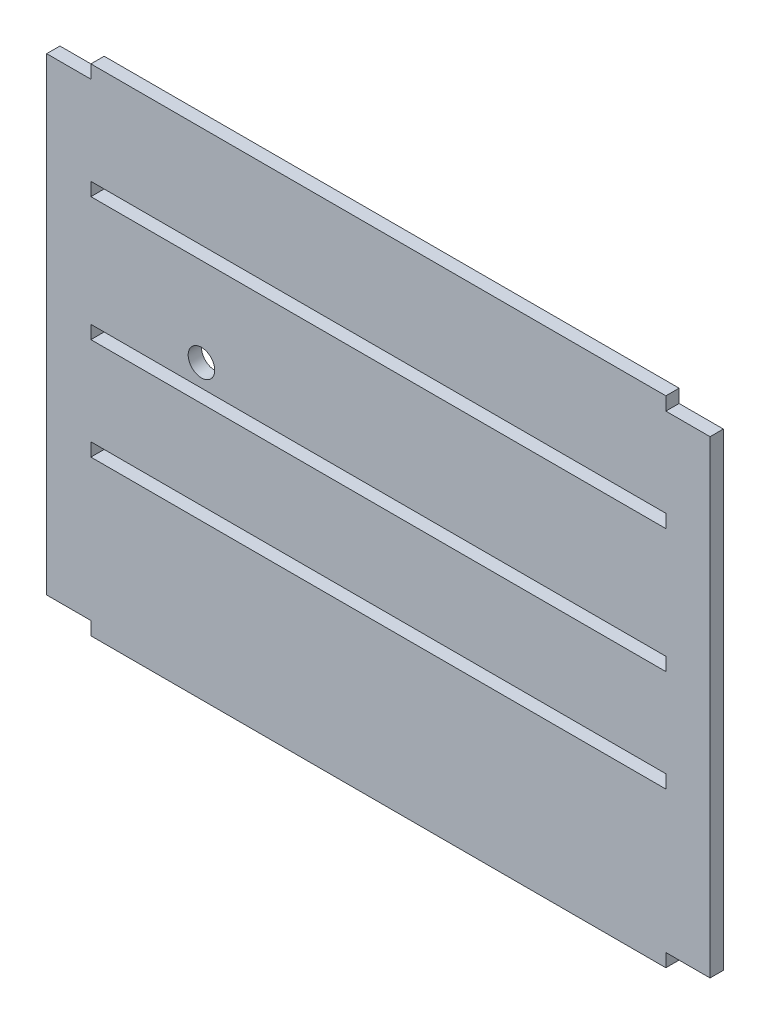
ISO-10303-21;
HEADER;
FILE_DESCRIPTION(('STEP AP214'),'2;1');
FILE_NAME('part.step','',(''),(''),'','','');
FILE_SCHEMA(('AUTOMOTIVE_DESIGN { 1 0 10303 214 1 1 1 1 }'));
ENDSEC;
DATA;
#1=APPLICATION_CONTEXT('core data for automotive mechanical design processes');
#2=APPLICATION_PROTOCOL_DEFINITION('international standard','automotive_design',2000,#1);
#3=PRODUCT_CONTEXT('',#1,'mechanical');
#4=PRODUCT('Part','Part','',(#3));
#5=PRODUCT_RELATED_PRODUCT_CATEGORY('part','',(#4));
#6=PRODUCT_DEFINITION_FORMATION('','',#4);
#7=PRODUCT_DEFINITION_CONTEXT('part definition',#1,'design');
#8=PRODUCT_DEFINITION('design','',#6,#7);
#9=PRODUCT_DEFINITION_SHAPE('','',#8);
#10=(LENGTH_UNIT() NAMED_UNIT(*) SI_UNIT(.MILLI.,.METRE.));
#11=(NAMED_UNIT(*) PLANE_ANGLE_UNIT() SI_UNIT($,.RADIAN.));
#12=(NAMED_UNIT(*) SI_UNIT($,.STERADIAN.) SOLID_ANGLE_UNIT());
#13=UNCERTAINTY_MEASURE_WITH_UNIT(LENGTH_MEASURE(1.E-05),#10,'distance_accuracy_value','');
#14=(GEOMETRIC_REPRESENTATION_CONTEXT(3) GLOBAL_UNCERTAINTY_ASSIGNED_CONTEXT((#13)) GLOBAL_UNIT_ASSIGNED_CONTEXT((#10,
#11,#12)) REPRESENTATION_CONTEXT('',''));
#15=CARTESIAN_POINT('',(0.,0.,0.));
#16=DIRECTION('',(0.,0.,1.));
#17=DIRECTION('',(1.,0.,0.));
#18=AXIS2_PLACEMENT_3D('',#15,#16,#17);
#19=CARTESIAN_POINT('',(0.,11.4814814814814,3.));
#20=DIRECTION('',(0.,1.,0.));
#21=DIRECTION('',(0.,0.,1.));
#22=AXIS2_PLACEMENT_3D('',#19,#20,#21);
#23=PLANE('',#22);
#24=DIRECTION('',(1.,0.,0.));
#25=VECTOR('',#24,1.);
#26=CARTESIAN_POINT('',(0.,11.4814814814814,0.));
#27=LINE('',#26,#25);
#28=CARTESIAN_POINT('',(-59.6969696969697,11.4814814814814,0.));
#29=VERTEX_POINT('',#28);
#30=CARTESIAN_POINT('',(70.3030303030303,11.4814814814814,0.));
#31=VERTEX_POINT('',#30);
#32=EDGE_CURVE('E288',#29,#31,#27,.T.);
#33=ORIENTED_EDGE('',*,*,#32,.T.);
#34=DIRECTION('',(0.,0.,-1.));
#35=VECTOR('',#34,1.);
#36=CARTESIAN_POINT('',(70.3030303030303,11.4814814814814,3.));
#37=LINE('',#36,#35);
#38=CARTESIAN_POINT('',(70.3030303030303,11.4814814814814,3.));
#39=VERTEX_POINT('',#38);
#40=EDGE_CURVE('E11',#39,#31,#37,.T.);
#41=ORIENTED_EDGE('',*,*,#40,.F.);
#42=DIRECTION('',(1.,0.,0.));
#43=VECTOR('',#42,1.);
#44=CARTESIAN_POINT('',(0.,11.4814814814814,3.));
#45=LINE('',#44,#43);
#46=CARTESIAN_POINT('',(-59.6969696969697,11.4814814814814,3.));
#47=VERTEX_POINT('',#46);
#48=EDGE_CURVE('E209',#47,#39,#45,.T.);
#49=ORIENTED_EDGE('',*,*,#48,.F.);
#50=DIRECTION('',(0.,0.,-1.));
#51=VECTOR('',#50,1.);
#52=CARTESIAN_POINT('',(-59.6969696969697,11.4814814814814,3.));
#53=LINE('',#52,#51);
#54=EDGE_CURVE('E52',#47,#29,#53,.T.);
#55=ORIENTED_EDGE('',*,*,#54,.T.);
#56=EDGE_LOOP('',(#33,#41,#49,#55));
#57=FACE_BOUND('',#56,.T.);
#58=ADVANCED_FACE('F33',(#57),#23,.F.);
#59=CARTESIAN_POINT('',(70.3030303030303,-3.25216845597262E-13,3.));
#60=DIRECTION('',(1.,0.,0.));
#61=DIRECTION('',(0.,1.,0.));
#62=AXIS2_PLACEMENT_3D('',#59,#60,#61);
#63=PLANE('',#62);
#64=DIRECTION('',(0.,-1.,0.));
#65=VECTOR('',#64,1.);
#66=CARTESIAN_POINT('',(70.3030303030303,-3.25216845597262E-13,0.));
#67=LINE('',#66,#65);
#68=CARTESIAN_POINT('',(70.3030303030303,8.48148148148137,0.));
#69=VERTEX_POINT('',#68);
#70=EDGE_CURVE('E215',#31,#69,#67,.T.);
#71=ORIENTED_EDGE('',*,*,#70,.T.);
#72=DIRECTION('',(0.,0.,-1.));
#73=VECTOR('',#72,1.);
#74=CARTESIAN_POINT('',(70.3030303030303,8.48148148148137,3.));
#75=LINE('',#74,#73);
#76=CARTESIAN_POINT('',(70.3030303030303,8.48148148148137,3.));
#77=VERTEX_POINT('',#76);
#78=EDGE_CURVE('E43',#77,#69,#75,.T.);
#79=ORIENTED_EDGE('',*,*,#78,.F.);
#80=DIRECTION('',(0.,-1.,0.));
#81=VECTOR('',#80,1.);
#82=CARTESIAN_POINT('',(70.3030303030303,-3.25216845597262E-13,3.));
#83=LINE('',#82,#81);
#84=EDGE_CURVE('E203',#39,#77,#83,.T.);
#85=ORIENTED_EDGE('',*,*,#84,.F.);
#86=ORIENTED_EDGE('',*,*,#40,.T.);
#87=EDGE_LOOP('',(#71,#79,#85,#86));
#88=FACE_BOUND('',#87,.T.);
#89=ADVANCED_FACE('F214',(#88),#63,.F.);
#90=CARTESIAN_POINT('',(0.,8.48148148148137,3.));
#91=DIRECTION('',(0.,1.,0.));
#92=DIRECTION('',(-1.,0.,0.));
#93=AXIS2_PLACEMENT_3D('',#90,#91,#92);
#94=PLANE('',#93);
#95=DIRECTION('',(1.,0.,0.));
#96=VECTOR('',#95,1.);
#97=CARTESIAN_POINT('',(0.,8.48148148148137,0.));
#98=LINE('',#97,#96);
#99=CARTESIAN_POINT('',(-59.6969696969697,8.48148148148137,0.));
#100=VERTEX_POINT('',#99);
#101=EDGE_CURVE('E291',#100,#69,#98,.T.);
#102=ORIENTED_EDGE('',*,*,#101,.F.);
#103=DIRECTION('',(0.,0.,-1.));
#104=VECTOR('',#103,1.);
#105=CARTESIAN_POINT('',(-59.6969696969697,8.48148148148137,3.));
#106=LINE('',#105,#104);
#107=CARTESIAN_POINT('',(-59.6969696969697,8.48148148148137,3.));
#108=VERTEX_POINT('',#107);
#109=EDGE_CURVE('E126',#108,#100,#106,.T.);
#110=ORIENTED_EDGE('',*,*,#109,.F.);
#111=DIRECTION('',(1.,0.,0.));
#112=VECTOR('',#111,1.);
#113=CARTESIAN_POINT('',(0.,8.48148148148137,3.));
#114=LINE('',#113,#112);
#115=EDGE_CURVE('E208',#108,#77,#114,.T.);
#116=ORIENTED_EDGE('',*,*,#115,.T.);
#117=ORIENTED_EDGE('',*,*,#78,.T.);
#118=EDGE_LOOP('',(#102,#110,#116,#117));
#119=FACE_BOUND('',#118,.T.);
#120=ADVANCED_FACE('F219',(#119),#94,.T.);
#121=CARTESIAN_POINT('',(0.,-16.5185185185186,3.));
#122=DIRECTION('',(0.,1.,0.));
#123=DIRECTION('',(0.,0.,1.));
#124=AXIS2_PLACEMENT_3D('',#121,#122,#123);
#125=PLANE('',#124);
#126=DIRECTION('',(1.,0.,0.));
#127=VECTOR('',#126,1.);
#128=CARTESIAN_POINT('',(0.,-16.5185185185186,0.));
#129=LINE('',#128,#127);
#130=CARTESIAN_POINT('',(-59.6969696969697,-16.5185185185186,0.));
#131=VERTEX_POINT('',#130);
#132=CARTESIAN_POINT('',(70.3030303030303,-16.5185185185186,0.));
#133=VERTEX_POINT('',#132);
#134=EDGE_CURVE('E276',#131,#133,#129,.T.);
#135=ORIENTED_EDGE('',*,*,#134,.T.);
#136=DIRECTION('',(0.,0.,-1.));
#137=VECTOR('',#136,1.);
#138=CARTESIAN_POINT('',(70.3030303030303,-16.5185185185186,3.));
#139=LINE('',#138,#137);
#140=CARTESIAN_POINT('',(70.3030303030303,-16.5185185185186,3.));
#141=VERTEX_POINT('',#140);
#142=EDGE_CURVE('E298',#141,#133,#139,.T.);
#143=ORIENTED_EDGE('',*,*,#142,.F.);
#144=DIRECTION('',(1.,0.,0.));
#145=VECTOR('',#144,1.);
#146=CARTESIAN_POINT('',(0.,-16.5185185185186,3.));
#147=LINE('',#146,#145);
#148=CARTESIAN_POINT('',(-59.6969696969697,-16.5185185185186,3.));
#149=VERTEX_POINT('',#148);
#150=EDGE_CURVE('E650',#149,#141,#147,.T.);
#151=ORIENTED_EDGE('',*,*,#150,.F.);
#152=DIRECTION('',(0.,0.,-1.));
#153=VECTOR('',#152,1.);
#154=CARTESIAN_POINT('',(-59.6969696969697,-16.5185185185186,3.));
#155=LINE('',#154,#153);
#156=EDGE_CURVE('E300',#149,#131,#155,.T.);
#157=ORIENTED_EDGE('',*,*,#156,.T.);
#158=EDGE_LOOP('',(#135,#143,#151,#157));
#159=FACE_BOUND('',#158,.T.);
#160=ADVANCED_FACE('F428',(#159),#125,.F.);
#161=CARTESIAN_POINT('',(70.3030303030303,0.,3.));
#162=DIRECTION('',(1.,0.,0.));
#163=DIRECTION('',(0.,0.,-1.));
#164=AXIS2_PLACEMENT_3D('',#161,#162,#163);
#165=PLANE('',#164);
#166=DIRECTION('',(0.,-1.,0.));
#167=VECTOR('',#166,1.);
#168=CARTESIAN_POINT('',(70.3030303030303,0.,0.));
#169=LINE('',#168,#167);
#170=CARTESIAN_POINT('',(70.3030303030303,-19.5185185185186,0.));
#171=VERTEX_POINT('',#170);
#172=EDGE_CURVE('E279',#133,#171,#169,.T.);
#173=ORIENTED_EDGE('',*,*,#172,.T.);
#174=DIRECTION('',(0.,0.,-1.));
#175=VECTOR('',#174,1.);
#176=CARTESIAN_POINT('',(70.3030303030303,-19.5185185185186,3.));
#177=LINE('',#176,#175);
#178=CARTESIAN_POINT('',(70.3030303030303,-19.5185185185186,3.));
#179=VERTEX_POINT('',#178);
#180=EDGE_CURVE('E305',#179,#171,#177,.T.);
#181=ORIENTED_EDGE('',*,*,#180,.F.);
#182=DIRECTION('',(0.,-1.,0.));
#183=VECTOR('',#182,1.);
#184=CARTESIAN_POINT('',(70.3030303030303,0.,3.));
#185=LINE('',#184,#183);
#186=EDGE_CURVE('E653',#141,#179,#185,.T.);
#187=ORIENTED_EDGE('',*,*,#186,.F.);
#188=ORIENTED_EDGE('',*,*,#142,.T.);
#189=EDGE_LOOP('',(#173,#181,#187,#188));
#190=FACE_BOUND('',#189,.T.);
#191=ADVANCED_FACE('F424',(#190),#165,.F.);
#192=CARTESIAN_POINT('',(0.,-19.5185185185186,3.));
#193=DIRECTION('',(0.,1.,0.));
#194=DIRECTION('',(0.,0.,1.));
#195=AXIS2_PLACEMENT_3D('',#192,#193,#194);
#196=PLANE('',#195);
#197=DIRECTION('',(1.,0.,0.));
#198=VECTOR('',#197,1.);
#199=CARTESIAN_POINT('',(0.,-19.5185185185186,0.));
#200=LINE('',#199,#198);
#201=CARTESIAN_POINT('',(-59.6969696969697,-19.5185185185186,0.));
#202=VERTEX_POINT('',#201);
#203=EDGE_CURVE('E282',#202,#171,#200,.T.);
#204=ORIENTED_EDGE('',*,*,#203,.F.);
#205=DIRECTION('',(0.,0.,-1.));
#206=VECTOR('',#205,1.);
#207=CARTESIAN_POINT('',(-59.6969696969697,-19.5185185185186,3.));
#208=LINE('',#207,#206);
#209=CARTESIAN_POINT('',(-59.6969696969697,-19.5185185185186,3.));
#210=VERTEX_POINT('',#209);
#211=EDGE_CURVE('E302',#210,#202,#208,.T.);
#212=ORIENTED_EDGE('',*,*,#211,.F.);
#213=DIRECTION('',(1.,0.,0.));
#214=VECTOR('',#213,1.);
#215=CARTESIAN_POINT('',(0.,-19.5185185185186,3.));
#216=LINE('',#215,#214);
#217=EDGE_CURVE('E661',#210,#179,#216,.T.);
#218=ORIENTED_EDGE('',*,*,#217,.T.);
#219=ORIENTED_EDGE('',*,*,#180,.T.);
#220=EDGE_LOOP('',(#204,#212,#218,#219));
#221=FACE_BOUND('',#220,.T.);
#222=ADVANCED_FACE('F420',(#221),#196,.T.);
#223=CARTESIAN_POINT('',(0.,-39.5185185185185,3.));
#224=DIRECTION('',(0.,1.,0.));
#225=DIRECTION('',(0.,0.,1.));
#226=AXIS2_PLACEMENT_3D('',#223,#224,#225);
#227=PLANE('',#226);
#228=DIRECTION('',(1.,0.,0.));
#229=VECTOR('',#228,1.);
#230=CARTESIAN_POINT('',(0.,-39.5185185185185,0.));
#231=LINE('',#230,#229);
#232=CARTESIAN_POINT('',(-59.6969696969697,-39.5185185185185,0.));
#233=VERTEX_POINT('',#232);
#234=CARTESIAN_POINT('',(70.3030303030303,-39.5185185185185,0.));
#235=VERTEX_POINT('',#234);
#236=EDGE_CURVE('E264',#233,#235,#231,.T.);
#237=ORIENTED_EDGE('',*,*,#236,.T.);
#238=DIRECTION('',(0.,0.,-1.));
#239=VECTOR('',#238,1.);
#240=CARTESIAN_POINT('',(70.3030303030303,-39.5185185185185,3.));
#241=LINE('',#240,#239);
#242=CARTESIAN_POINT('',(70.3030303030303,-39.5185185185185,3.));
#243=VERTEX_POINT('',#242);
#244=EDGE_CURVE('E303',#243,#235,#241,.T.);
#245=ORIENTED_EDGE('',*,*,#244,.F.);
#246=DIRECTION('',(1.,0.,0.));
#247=VECTOR('',#246,1.);
#248=CARTESIAN_POINT('',(0.,-39.5185185185185,3.));
#249=LINE('',#248,#247);
#250=CARTESIAN_POINT('',(-59.6969696969697,-39.5185185185185,3.));
#251=VERTEX_POINT('',#250);
#252=EDGE_CURVE('E645',#251,#243,#249,.T.);
#253=ORIENTED_EDGE('',*,*,#252,.F.);
#254=DIRECTION('',(0.,0.,-1.));
#255=VECTOR('',#254,1.);
#256=CARTESIAN_POINT('',(-59.6969696969697,-39.5185185185185,3.));
#257=LINE('',#256,#255);
#258=EDGE_CURVE('E309',#251,#233,#257,.T.);
#259=ORIENTED_EDGE('',*,*,#258,.T.);
#260=EDGE_LOOP('',(#237,#245,#253,#259));
#261=FACE_BOUND('',#260,.T.);
#262=ADVANCED_FACE('F423',(#261),#227,.F.);
#263=CARTESIAN_POINT('',(70.3030303030303,0.,3.));
#264=DIRECTION('',(1.,0.,0.));
#265=DIRECTION('',(0.,0.,-1.));
#266=AXIS2_PLACEMENT_3D('',#263,#264,#265);
#267=PLANE('',#266);
#268=DIRECTION('',(0.,-1.,0.));
#269=VECTOR('',#268,1.);
#270=CARTESIAN_POINT('',(70.3030303030303,0.,0.));
#271=LINE('',#270,#269);
#272=CARTESIAN_POINT('',(70.3030303030303,-42.5185185185185,0.));
#273=VERTEX_POINT('',#272);
#274=EDGE_CURVE('E267',#235,#273,#271,.T.);
#275=ORIENTED_EDGE('',*,*,#274,.T.);
#276=DIRECTION('',(0.,0.,-1.));
#277=VECTOR('',#276,1.);
#278=CARTESIAN_POINT('',(70.3030303030303,-42.5185185185185,3.));
#279=LINE('',#278,#277);
#280=CARTESIAN_POINT('',(70.3030303030303,-42.5185185185185,3.));
#281=VERTEX_POINT('',#280);
#282=EDGE_CURVE('E313',#281,#273,#279,.T.);
#283=ORIENTED_EDGE('',*,*,#282,.F.);
#284=DIRECTION('',(0.,-1.,0.));
#285=VECTOR('',#284,1.);
#286=CARTESIAN_POINT('',(70.3030303030303,0.,3.));
#287=LINE('',#286,#285);
#288=EDGE_CURVE('E675',#243,#281,#287,.T.);
#289=ORIENTED_EDGE('',*,*,#288,.F.);
#290=ORIENTED_EDGE('',*,*,#244,.T.);
#291=EDGE_LOOP('',(#275,#283,#289,#290));
#292=FACE_BOUND('',#291,.T.);
#293=ADVANCED_FACE('F439',(#292),#267,.F.);
#294=CARTESIAN_POINT('',(0.,-42.5185185185185,3.));
#295=DIRECTION('',(0.,1.,0.));
#296=DIRECTION('',(0.,0.,1.));
#297=AXIS2_PLACEMENT_3D('',#294,#295,#296);
#298=PLANE('',#297);
#299=DIRECTION('',(1.,0.,0.));
#300=VECTOR('',#299,1.);
#301=CARTESIAN_POINT('',(0.,-42.5185185185185,0.));
#302=LINE('',#301,#300);
#303=CARTESIAN_POINT('',(-59.6969696969697,-42.5185185185185,0.));
#304=VERTEX_POINT('',#303);
#305=EDGE_CURVE('E270',#304,#273,#302,.T.);
#306=ORIENTED_EDGE('',*,*,#305,.F.);
#307=DIRECTION('',(0.,0.,-1.));
#308=VECTOR('',#307,1.);
#309=CARTESIAN_POINT('',(-59.6969696969697,-42.5185185185185,3.));
#310=LINE('',#309,#308);
#311=CARTESIAN_POINT('',(-59.6969696969697,-42.5185185185185,3.));
#312=VERTEX_POINT('',#311);
#313=EDGE_CURVE('E311',#312,#304,#310,.T.);
#314=ORIENTED_EDGE('',*,*,#313,.F.);
#315=DIRECTION('',(1.,0.,0.));
#316=VECTOR('',#315,1.);
#317=CARTESIAN_POINT('',(0.,-42.5185185185185,3.));
#318=LINE('',#317,#316);
#319=EDGE_CURVE('E672',#312,#281,#318,.T.);
#320=ORIENTED_EDGE('',*,*,#319,.T.);
#321=ORIENTED_EDGE('',*,*,#282,.T.);
#322=EDGE_LOOP('',(#306,#314,#320,#321));
#323=FACE_BOUND('',#322,.T.);
#324=ADVANCED_FACE('F436',(#323),#298,.T.);
#325=CARTESIAN_POINT('',(0.,-77.5185185185185,3.));
#326=DIRECTION('',(0.,1.,0.));
#327=DIRECTION('',(0.,0.,1.));
#328=AXIS2_PLACEMENT_3D('',#325,#326,#327);
#329=PLANE('',#328);
#330=DIRECTION('',(1.,0.,0.));
#331=VECTOR('',#330,1.);
#332=CARTESIAN_POINT('',(0.,-77.5185185185185,0.));
#333=LINE('',#332,#331);
#334=CARTESIAN_POINT('',(-59.6969696969697,-77.5185185185185,0.));
#335=VERTEX_POINT('',#334);
#336=CARTESIAN_POINT('',(70.3030303030303,-77.5185185185185,0.));
#337=VERTEX_POINT('',#336);
#338=EDGE_CURVE('E229',#335,#337,#333,.T.);
#339=ORIENTED_EDGE('',*,*,#338,.T.);
#340=DIRECTION('',(0.,0.,-1.));
#341=VECTOR('',#340,1.);
#342=CARTESIAN_POINT('',(70.3030303030303,-77.5185185185185,3.));
#343=LINE('',#342,#341);
#344=CARTESIAN_POINT('',(70.3030303030303,-77.5185185185185,3.));
#345=VERTEX_POINT('',#344);
#346=EDGE_CURVE('E37',#345,#337,#343,.T.);
#347=ORIENTED_EDGE('',*,*,#346,.F.);
#348=DIRECTION('',(1.,0.,0.));
#349=VECTOR('',#348,1.);
#350=CARTESIAN_POINT('',(0.,-77.5185185185185,3.));
#351=LINE('',#350,#349);
#352=CARTESIAN_POINT('',(-59.6969696969697,-77.5185185185185,3.));
#353=VERTEX_POINT('',#352);
#354=EDGE_CURVE('E640',#353,#345,#351,.T.);
#355=ORIENTED_EDGE('',*,*,#354,.F.);
#356=DIRECTION('',(0.,0.,-1.));
#357=VECTOR('',#356,1.);
#358=CARTESIAN_POINT('',(-59.6969696969697,-77.5185185185185,3.));
#359=LINE('',#358,#357);
#360=EDGE_CURVE('E222',#353,#335,#359,.T.);
#361=ORIENTED_EDGE('',*,*,#360,.T.);
#362=EDGE_LOOP('',(#339,#347,#355,#361));
#363=FACE_BOUND('',#362,.T.);
#364=ADVANCED_FACE('F345',(#363),#329,.F.);
#365=CARTESIAN_POINT('',(70.3030303030303,0.,3.));
#366=DIRECTION('',(-1.,0.,0.));
#367=DIRECTION('',(0.,0.,1.));
#368=AXIS2_PLACEMENT_3D('',#365,#366,#367);
#369=PLANE('',#368);
#370=DIRECTION('',(0.,1.,0.));
#371=VECTOR('',#370,1.);
#372=CARTESIAN_POINT('',(70.3030303030303,0.,0.));
#373=LINE('',#372,#371);
#374=CARTESIAN_POINT('',(70.3030303030303,-74.5185185185185,0.));
#375=VERTEX_POINT('',#374);
#376=EDGE_CURVE('E232',#337,#375,#373,.T.);
#377=ORIENTED_EDGE('',*,*,#376,.T.);
#378=DIRECTION('',(0.,0.,-1.));
#379=VECTOR('',#378,1.);
#380=CARTESIAN_POINT('',(70.3030303030303,-74.5185185185185,3.));
#381=LINE('',#380,#379);
#382=CARTESIAN_POINT('',(70.3030303030303,-74.5185185185185,3.));
#383=VERTEX_POINT('',#382);
#384=EDGE_CURVE('E336',#383,#375,#381,.T.);
#385=ORIENTED_EDGE('',*,*,#384,.F.);
#386=DIRECTION('',(0.,1.,0.));
#387=VECTOR('',#386,1.);
#388=CARTESIAN_POINT('',(70.3030303030303,0.,3.));
#389=LINE('',#388,#387);
#390=EDGE_CURVE('E139',#345,#383,#389,.T.);
#391=ORIENTED_EDGE('',*,*,#390,.F.);
#392=ORIENTED_EDGE('',*,*,#346,.T.);
#393=EDGE_LOOP('',(#377,#385,#391,#392));
#394=FACE_BOUND('',#393,.T.);
#395=ADVANCED_FACE('F341',(#394),#369,.F.);
#396=CARTESIAN_POINT('',(0.,-74.5185185185185,3.));
#397=DIRECTION('',(0.,-1.,0.));
#398=DIRECTION('',(0.,0.,-1.));
#399=AXIS2_PLACEMENT_3D('',#396,#397,#398);
#400=PLANE('',#399);
#401=DIRECTION('',(-1.,0.,0.));
#402=VECTOR('',#401,1.);
#403=CARTESIAN_POINT('',(0.,-74.5185185185185,0.));
#404=LINE('',#403,#402);
#405=CARTESIAN_POINT('',(80.3030303030303,-74.5185185185185,0.));
#406=VERTEX_POINT('',#405);
#407=EDGE_CURVE('E235',#406,#375,#404,.T.);
#408=ORIENTED_EDGE('',*,*,#407,.F.);
#409=DIRECTION('',(0.,0.,-1.));
#410=VECTOR('',#409,1.);
#411=CARTESIAN_POINT('',(80.3030303030303,-74.5185185185185,3.));
#412=LINE('',#411,#410);
#413=CARTESIAN_POINT('',(80.3030303030303,-74.5185185185185,3.));
#414=VERTEX_POINT('',#413);
#415=EDGE_CURVE('E335',#414,#406,#412,.T.);
#416=ORIENTED_EDGE('',*,*,#415,.F.);
#417=DIRECTION('',(-1.,0.,0.));
#418=VECTOR('',#417,1.);
#419=CARTESIAN_POINT('',(0.,-74.5185185185185,3.));
#420=LINE('',#419,#418);
#421=EDGE_CURVE('E692',#414,#383,#420,.T.);
#422=ORIENTED_EDGE('',*,*,#421,.T.);
#423=ORIENTED_EDGE('',*,*,#384,.T.);
#424=EDGE_LOOP('',(#408,#416,#422,#423));
#425=FACE_BOUND('',#424,.T.);
#426=ADVANCED_FACE('F397',(#425),#400,.T.);
#427=CARTESIAN_POINT('',(80.3030303030303,0.,3.));
#428=DIRECTION('',(1.,0.,0.));
#429=DIRECTION('',(0.,1.,0.));
#430=AXIS2_PLACEMENT_3D('',#427,#428,#429);
#431=PLANE('',#430);
#432=DIRECTION('',(0.,-1.,0.));
#433=VECTOR('',#432,1.);
#434=CARTESIAN_POINT('',(80.3030303030303,0.,0.));
#435=LINE('',#434,#433);
#436=CARTESIAN_POINT('',(80.3030303030303,31.4814814814815,0.));
#437=VERTEX_POINT('',#436);
#438=EDGE_CURVE('E238',#437,#406,#435,.T.);
#439=ORIENTED_EDGE('',*,*,#438,.F.);
#440=DIRECTION('',(0.,0.,-1.));
#441=VECTOR('',#440,1.);
#442=CARTESIAN_POINT('',(80.3030303030303,31.4814814814815,3.));
#443=LINE('',#442,#441);
#444=CARTESIAN_POINT('',(80.3030303030303,31.4814814814815,3.));
#445=VERTEX_POINT('',#444);
#446=EDGE_CURVE('E333',#445,#437,#443,.T.);
#447=ORIENTED_EDGE('',*,*,#446,.F.);
#448=DIRECTION('',(0.,-1.,0.));
#449=VECTOR('',#448,1.);
#450=CARTESIAN_POINT('',(80.3030303030303,0.,3.));
#451=LINE('',#450,#449);
#452=EDGE_CURVE('E395',#445,#414,#451,.T.);
#453=ORIENTED_EDGE('',*,*,#452,.T.);
#454=ORIENTED_EDGE('',*,*,#415,.T.);
#455=EDGE_LOOP('',(#439,#447,#453,#454));
#456=FACE_BOUND('',#455,.T.);
#457=ADVANCED_FACE('F391',(#456),#431,.T.);
#458=CARTESIAN_POINT('',(0.,31.4814814814815,3.));
#459=DIRECTION('',(0.,-1.,0.));
#460=DIRECTION('',(0.,0.,-1.));
#461=AXIS2_PLACEMENT_3D('',#458,#459,#460);
#462=PLANE('',#461);
#463=DIRECTION('',(-1.,0.,0.));
#464=VECTOR('',#463,1.);
#465=CARTESIAN_POINT('',(0.,31.4814814814815,0.));
#466=LINE('',#465,#464);
#467=CARTESIAN_POINT('',(70.3030303030303,31.4814814814815,0.));
#468=VERTEX_POINT('',#467);
#469=EDGE_CURVE('E241',#437,#468,#466,.T.);
#470=ORIENTED_EDGE('',*,*,#469,.T.);
#471=DIRECTION('',(0.,0.,-1.));
#472=VECTOR('',#471,1.);
#473=CARTESIAN_POINT('',(70.3030303030303,31.4814814814815,3.));
#474=LINE('',#473,#472);
#475=CARTESIAN_POINT('',(70.3030303030303,31.4814814814815,3.));
#476=VERTEX_POINT('',#475);
#477=EDGE_CURVE('E331',#476,#468,#474,.T.);
#478=ORIENTED_EDGE('',*,*,#477,.F.);
#479=DIRECTION('',(-1.,0.,0.));
#480=VECTOR('',#479,1.);
#481=CARTESIAN_POINT('',(0.,31.4814814814815,3.));
#482=LINE('',#481,#480);
#483=EDGE_CURVE('E689',#445,#476,#482,.T.);
#484=ORIENTED_EDGE('',*,*,#483,.F.);
#485=ORIENTED_EDGE('',*,*,#446,.T.);
#486=EDGE_LOOP('',(#470,#478,#484,#485));
#487=FACE_BOUND('',#486,.T.);
#488=ADVANCED_FACE('F404',(#487),#462,.F.);
#489=CARTESIAN_POINT('',(70.3030303030305,3.25216845597266E-13,3.));
#490=DIRECTION('',(1.,0.,0.));
#491=DIRECTION('',(0.,1.,0.));
#492=AXIS2_PLACEMENT_3D('',#489,#490,#491);
#493=PLANE('',#492);
#494=DIRECTION('',(0.,-1.,0.));
#495=VECTOR('',#494,1.);
#496=CARTESIAN_POINT('',(70.3030303030305,3.25216845597266E-13,0.));
#497=LINE('',#496,#495);
#498=CARTESIAN_POINT('',(70.3030303030303,34.4814814814815,0.));
#499=VERTEX_POINT('',#498);
#500=EDGE_CURVE('E244',#499,#468,#497,.T.);
#501=ORIENTED_EDGE('',*,*,#500,.F.);
#502=DIRECTION('',(0.,0.,-1.));
#503=VECTOR('',#502,1.);
#504=CARTESIAN_POINT('',(70.3030303030303,34.4814814814815,3.));
#505=LINE('',#504,#503);
#506=CARTESIAN_POINT('',(70.3030303030303,34.4814814814815,3.));
#507=VERTEX_POINT('',#506);
#508=EDGE_CURVE('E329',#507,#499,#505,.T.);
#509=ORIENTED_EDGE('',*,*,#508,.F.);
#510=DIRECTION('',(0.,-1.,0.));
#511=VECTOR('',#510,1.);
#512=CARTESIAN_POINT('',(70.3030303030305,3.25216845597266E-13,3.));
#513=LINE('',#512,#511);
#514=EDGE_CURVE('E687',#507,#476,#513,.T.);
#515=ORIENTED_EDGE('',*,*,#514,.T.);
#516=ORIENTED_EDGE('',*,*,#477,.T.);
#517=EDGE_LOOP('',(#501,#509,#515,#516));
#518=FACE_BOUND('',#517,.T.);
#519=ADVANCED_FACE('F385',(#518),#493,.T.);
#520=CARTESIAN_POINT('',(0.,34.4814814814815,3.));
#521=DIRECTION('',(0.,1.,0.));
#522=DIRECTION('',(0.,0.,1.));
#523=AXIS2_PLACEMENT_3D('',#520,#521,#522);
#524=PLANE('',#523);
#525=DIRECTION('',(1.,0.,0.));
#526=VECTOR('',#525,1.);
#527=CARTESIAN_POINT('',(0.,34.4814814814815,0.));
#528=LINE('',#527,#526);
#529=CARTESIAN_POINT('',(-59.6969696969697,34.4814814814815,0.));
#530=VERTEX_POINT('',#529);
#531=EDGE_CURVE('E247',#530,#499,#528,.T.);
#532=ORIENTED_EDGE('',*,*,#531,.F.);
#533=DIRECTION('',(0.,0.,-1.));
#534=VECTOR('',#533,1.);
#535=CARTESIAN_POINT('',(-59.6969696969697,34.4814814814815,3.));
#536=LINE('',#535,#534);
#537=CARTESIAN_POINT('',(-59.6969696969697,34.4814814814815,3.));
#538=VERTEX_POINT('',#537);
#539=EDGE_CURVE('E327',#538,#530,#536,.T.);
#540=ORIENTED_EDGE('',*,*,#539,.F.);
#541=DIRECTION('',(1.,0.,0.));
#542=VECTOR('',#541,1.);
#543=CARTESIAN_POINT('',(0.,34.4814814814815,3.));
#544=LINE('',#543,#542);
#545=EDGE_CURVE('E381',#538,#507,#544,.T.);
#546=ORIENTED_EDGE('',*,*,#545,.T.);
#547=ORIENTED_EDGE('',*,*,#508,.T.);
#548=EDGE_LOOP('',(#532,#540,#546,#547));
#549=FACE_BOUND('',#548,.T.);
#550=ADVANCED_FACE('F377',(#549),#524,.T.);
#551=CARTESIAN_POINT('',(-59.6969696969696,-1.38076979704012E-13,3.));
#552=DIRECTION('',(1.,0.,0.));
#553=DIRECTION('',(0.,1.,0.));
#554=AXIS2_PLACEMENT_3D('',#551,#552,#553);
#555=PLANE('',#554);
#556=DIRECTION('',(0.,-1.,0.));
#557=VECTOR('',#556,1.);
#558=CARTESIAN_POINT('',(-59.6969696969696,-1.38076979704012E-13,0.));
#559=LINE('',#558,#557);
#560=CARTESIAN_POINT('',(-59.6969696969697,31.4814814814815,0.));
#561=VERTEX_POINT('',#560);
#562=EDGE_CURVE('E250',#530,#561,#559,.T.);
#563=ORIENTED_EDGE('',*,*,#562,.T.);
#564=DIRECTION('',(0.,0.,-1.));
#565=VECTOR('',#564,1.);
#566=CARTESIAN_POINT('',(-59.6969696969697,31.4814814814815,3.));
#567=LINE('',#566,#565);
#568=CARTESIAN_POINT('',(-59.6969696969697,31.4814814814815,3.));
#569=VERTEX_POINT('',#568);
#570=EDGE_CURVE('E325',#569,#561,#567,.T.);
#571=ORIENTED_EDGE('',*,*,#570,.F.);
#572=DIRECTION('',(0.,-1.,0.));
#573=VECTOR('',#572,1.);
#574=CARTESIAN_POINT('',(-59.6969696969696,-1.38076979704012E-13,3.));
#575=LINE('',#574,#573);
#576=EDGE_CURVE('E684',#538,#569,#575,.T.);
#577=ORIENTED_EDGE('',*,*,#576,.F.);
#578=ORIENTED_EDGE('',*,*,#539,.T.);
#579=EDGE_LOOP('',(#563,#571,#577,#578));
#580=FACE_BOUND('',#579,.T.);
#581=ADVANCED_FACE('F374',(#580),#555,.F.);
#582=CARTESIAN_POINT('',(0.,31.4814814814815,3.));
#583=DIRECTION('',(0.,1.,0.));
#584=DIRECTION('',(0.,0.,1.));
#585=AXIS2_PLACEMENT_3D('',#582,#583,#584);
#586=PLANE('',#585);
#587=DIRECTION('',(1.,0.,0.));
#588=VECTOR('',#587,1.);
#589=CARTESIAN_POINT('',(0.,31.4814814814815,0.));
#590=LINE('',#589,#588);
#591=CARTESIAN_POINT('',(-69.6969696969697,31.4814814814815,0.));
#592=VERTEX_POINT('',#591);
#593=EDGE_CURVE('E253',#592,#561,#590,.T.);
#594=ORIENTED_EDGE('',*,*,#593,.F.);
#595=DIRECTION('',(0.,0.,-1.));
#596=VECTOR('',#595,1.);
#597=CARTESIAN_POINT('',(-69.6969696969697,31.4814814814815,3.));
#598=LINE('',#597,#596);
#599=CARTESIAN_POINT('',(-69.6969696969697,31.4814814814815,3.));
#600=VERTEX_POINT('',#599);
#601=EDGE_CURVE('E323',#600,#592,#598,.T.);
#602=ORIENTED_EDGE('',*,*,#601,.F.);
#603=DIRECTION('',(1.,0.,0.));
#604=VECTOR('',#603,1.);
#605=CARTESIAN_POINT('',(0.,31.4814814814815,3.));
#606=LINE('',#605,#604);
#607=EDGE_CURVE('E371',#600,#569,#606,.T.);
#608=ORIENTED_EDGE('',*,*,#607,.T.);
#609=ORIENTED_EDGE('',*,*,#570,.T.);
#610=EDGE_LOOP('',(#594,#602,#608,#609));
#611=FACE_BOUND('',#610,.T.);
#612=ADVANCED_FACE('F366',(#611),#586,.T.);
#613=CARTESIAN_POINT('',(-69.6969696969697,0.,3.));
#614=DIRECTION('',(1.,0.,0.));
#615=DIRECTION('',(0.,0.,-1.));
#616=AXIS2_PLACEMENT_3D('',#613,#614,#615);
#617=PLANE('',#616);
#618=DIRECTION('',(0.,-1.,0.));
#619=VECTOR('',#618,1.);
#620=CARTESIAN_POINT('',(-69.6969696969697,0.,0.));
#621=LINE('',#620,#619);
#622=CARTESIAN_POINT('',(-69.6969696969697,-74.5185185185185,0.));
#623=VERTEX_POINT('',#622);
#624=EDGE_CURVE('E256',#592,#623,#621,.T.);
#625=ORIENTED_EDGE('',*,*,#624,.T.);
#626=DIRECTION('',(0.,0.,-1.));
#627=VECTOR('',#626,1.);
#628=CARTESIAN_POINT('',(-69.6969696969697,-74.5185185185185,3.));
#629=LINE('',#628,#627);
#630=CARTESIAN_POINT('',(-69.6969696969697,-74.5185185185185,3.));
#631=VERTEX_POINT('',#630);
#632=EDGE_CURVE('E320',#631,#623,#629,.T.);
#633=ORIENTED_EDGE('',*,*,#632,.F.);
#634=DIRECTION('',(0.,-1.,0.));
#635=VECTOR('',#634,1.);
#636=CARTESIAN_POINT('',(-69.6969696969697,0.,3.));
#637=LINE('',#636,#635);
#638=EDGE_CURVE('E681',#600,#631,#637,.T.);
#639=ORIENTED_EDGE('',*,*,#638,.F.);
#640=ORIENTED_EDGE('',*,*,#601,.T.);
#641=EDGE_LOOP('',(#625,#633,#639,#640));
#642=FACE_BOUND('',#641,.T.);
#643=ADVANCED_FACE('F451',(#642),#617,.F.);
#644=CARTESIAN_POINT('',(0.,-74.5185185185185,3.));
#645=DIRECTION('',(0.,1.,0.));
#646=DIRECTION('',(0.,0.,1.));
#647=AXIS2_PLACEMENT_3D('',#644,#645,#646);
#648=PLANE('',#647);
#649=DIRECTION('',(1.,0.,0.));
#650=VECTOR('',#649,1.);
#651=CARTESIAN_POINT('',(0.,-74.5185185185185,0.));
#652=LINE('',#651,#650);
#653=CARTESIAN_POINT('',(-59.6969696969697,-74.5185185185185,0.));
#654=VERTEX_POINT('',#653);
#655=EDGE_CURVE('E258',#623,#654,#652,.T.);
#656=ORIENTED_EDGE('',*,*,#655,.T.);
#657=DIRECTION('',(0.,0.,-1.));
#658=VECTOR('',#657,1.);
#659=CARTESIAN_POINT('',(-59.6969696969697,-74.5185185185185,3.));
#660=LINE('',#659,#658);
#661=CARTESIAN_POINT('',(-59.6969696969697,-74.5185185185185,3.));
#662=VERTEX_POINT('',#661);
#663=EDGE_CURVE('E318',#662,#654,#660,.T.);
#664=ORIENTED_EDGE('',*,*,#663,.F.);
#665=DIRECTION('',(1.,0.,0.));
#666=VECTOR('',#665,1.);
#667=CARTESIAN_POINT('',(0.,-74.5185185185185,3.));
#668=LINE('',#667,#666);
#669=EDGE_CURVE('E679',#631,#662,#668,.T.);
#670=ORIENTED_EDGE('',*,*,#669,.F.);
#671=ORIENTED_EDGE('',*,*,#632,.T.);
#672=EDGE_LOOP('',(#656,#664,#670,#671));
#673=FACE_BOUND('',#672,.T.);
#674=ADVANCED_FACE('F359',(#673),#648,.F.);
#675=CARTESIAN_POINT('',(-59.6969696969697,0.,3.));
#676=DIRECTION('',(1.,0.,0.));
#677=DIRECTION('',(0.,0.,-1.));
#678=AXIS2_PLACEMENT_3D('',#675,#676,#677);
#679=PLANE('',#678);
#680=DIRECTION('',(0.,-1.,0.));
#681=VECTOR('',#680,1.);
#682=CARTESIAN_POINT('',(-59.6969696969697,0.,0.));
#683=LINE('',#682,#681);
#684=EDGE_CURVE('E285',#131,#202,#683,.T.);
#685=ORIENTED_EDGE('',*,*,#684,.F.);
#686=ORIENTED_EDGE('',*,*,#156,.F.);
#687=DIRECTION('',(0.,-1.,0.));
#688=VECTOR('',#687,1.);
#689=CARTESIAN_POINT('',(-59.6969696969697,0.,3.));
#690=LINE('',#689,#688);
#691=EDGE_CURVE('E656',#149,#210,#690,.T.);
#692=ORIENTED_EDGE('',*,*,#691,.T.);
#693=ORIENTED_EDGE('',*,*,#211,.T.);
#694=EDGE_LOOP('',(#685,#686,#692,#693));
#695=FACE_BOUND('',#694,.T.);
#696=ADVANCED_FACE('F415',(#695),#679,.T.);
#697=CARTESIAN_POINT('',(-59.6969696969698,-1.38076979704013E-13,3.));
#698=DIRECTION('',(1.,0.,0.));
#699=DIRECTION('',(0.,1.,0.));
#700=AXIS2_PLACEMENT_3D('',#697,#698,#699);
#701=PLANE('',#700);
#702=DIRECTION('',(0.,-1.,0.));
#703=VECTOR('',#702,1.);
#704=CARTESIAN_POINT('',(-59.6969696969698,-1.38076979704013E-13,0.));
#705=LINE('',#704,#703);
#706=EDGE_CURVE('E273',#233,#304,#705,.T.);
#707=ORIENTED_EDGE('',*,*,#706,.F.);
#708=ORIENTED_EDGE('',*,*,#258,.F.);
#709=DIRECTION('',(0.,-1.,0.));
#710=VECTOR('',#709,1.);
#711=CARTESIAN_POINT('',(-59.6969696969698,-1.38076979704013E-13,3.));
#712=LINE('',#711,#710);
#713=EDGE_CURVE('E657',#251,#312,#712,.T.);
#714=ORIENTED_EDGE('',*,*,#713,.T.);
#715=ORIENTED_EDGE('',*,*,#313,.T.);
#716=EDGE_LOOP('',(#707,#708,#714,#715));
#717=FACE_BOUND('',#716,.T.);
#718=ADVANCED_FACE('F418',(#717),#701,.T.);
#719=CARTESIAN_POINT('',(-59.69696969697,-2.76153959408026E-13,3.));
#720=DIRECTION('',(-1.,0.,0.));
#721=DIRECTION('',(0.,-1.,0.));
#722=AXIS2_PLACEMENT_3D('',#719,#720,#721);
#723=PLANE('',#722);
#724=DIRECTION('',(0.,1.,0.));
#725=VECTOR('',#724,1.);
#726=CARTESIAN_POINT('',(-59.69696969697,-2.76153959408026E-13,0.));
#727=LINE('',#726,#725);
#728=EDGE_CURVE('E261',#335,#654,#727,.T.);
#729=ORIENTED_EDGE('',*,*,#728,.F.);
#730=ORIENTED_EDGE('',*,*,#360,.F.);
#731=DIRECTION('',(0.,1.,0.));
#732=VECTOR('',#731,1.);
#733=CARTESIAN_POINT('',(-59.69696969697,-2.76153959408026E-13,3.));
#734=LINE('',#733,#732);
#735=EDGE_CURVE('E356',#353,#662,#734,.T.);
#736=ORIENTED_EDGE('',*,*,#735,.T.);
#737=ORIENTED_EDGE('',*,*,#663,.T.);
#738=EDGE_LOOP('',(#729,#730,#736,#737));
#739=FACE_BOUND('',#738,.T.);
#740=ADVANCED_FACE('F352',(#739),#723,.T.);
#741=CARTESIAN_POINT('',(-34.6969696969697,-11.5185185185186,3.));
#742=DIRECTION('',(0.,0.,-1.));
#743=DIRECTION('',(-1.,0.,0.));
#744=AXIS2_PLACEMENT_3D('',#741,#742,#743);
#745=CYLINDRICAL_SURFACE('',#744,3.);
#746=CARTESIAN_POINT('',(-34.6969696969697,-11.5185185185186,3.));
#747=DIRECTION('',(0.,0.,1.));
#748=DIRECTION('',(1.,0.,0.));
#749=AXIS2_PLACEMENT_3D('',#746,#747,#748);
#750=CIRCLE('',#749,3.);
#751=CARTESIAN_POINT('',(-31.6969696969697,-11.5185185185186,3.));
#752=VERTEX_POINT('',#751);
#753=EDGE_CURVE('E296',#752,#752,#750,.T.);
#754=ORIENTED_EDGE('',*,*,#753,.T.);
#755=EDGE_LOOP('',(#754));
#756=FACE_BOUND('',#755,.T.);
#757=CARTESIAN_POINT('',(-34.6969696969697,-11.5185185185186,0.));
#758=DIRECTION('',(0.,0.,1.));
#759=DIRECTION('',(1.,0.,0.));
#760=AXIS2_PLACEMENT_3D('',#757,#758,#759);
#761=CIRCLE('',#760,3.);
#762=CARTESIAN_POINT('',(-31.6969696969697,-11.5185185185186,0.));
#763=VERTEX_POINT('',#762);
#764=EDGE_CURVE('E226',#763,#763,#761,.T.);
#765=ORIENTED_EDGE('',*,*,#764,.F.);
#766=EDGE_LOOP('',(#765));
#767=FACE_BOUND('',#766,.T.);
#768=ADVANCED_FACE('F35',(#756,#767),#745,.F.);
#769=CARTESIAN_POINT('',(-59.6969696969697,0.,3.));
#770=DIRECTION('',(1.,0.,0.));
#771=DIRECTION('',(0.,0.,-1.));
#772=AXIS2_PLACEMENT_3D('',#769,#770,#771);
#773=PLANE('',#772);
#774=DIRECTION('',(0.,-1.,0.));
#775=VECTOR('',#774,1.);
#776=CARTESIAN_POINT('',(-59.6969696969697,0.,0.));
#777=LINE('',#776,#775);
#778=EDGE_CURVE('E293',#29,#100,#777,.T.);
#779=ORIENTED_EDGE('',*,*,#778,.F.);
#780=ORIENTED_EDGE('',*,*,#54,.F.);
#781=DIRECTION('',(0.,-1.,0.));
#782=VECTOR('',#781,1.);
#783=CARTESIAN_POINT('',(-59.6969696969697,0.,3.));
#784=LINE('',#783,#782);
#785=EDGE_CURVE('E220',#47,#108,#784,.T.);
#786=ORIENTED_EDGE('',*,*,#785,.T.);
#787=ORIENTED_EDGE('',*,*,#109,.T.);
#788=EDGE_LOOP('',(#779,#780,#786,#787));
#789=FACE_BOUND('',#788,.T.);
#790=ADVANCED_FACE('F509',(#789),#773,.T.);
#791=CARTESIAN_POINT('',(0.,0.,3.));
#792=DIRECTION('',(0.,0.,1.));
#793=DIRECTION('',(1.,0.,0.));
#794=AXIS2_PLACEMENT_3D('',#791,#792,#793);
#795=PLANE('',#794);
#796=ORIENTED_EDGE('',*,*,#753,.F.);
#797=EDGE_LOOP('',(#796));
#798=FACE_BOUND('',#797,.T.);
#799=ORIENTED_EDGE('',*,*,#354,.T.);
#800=ORIENTED_EDGE('',*,*,#390,.T.);
#801=ORIENTED_EDGE('',*,*,#421,.F.);
#802=ORIENTED_EDGE('',*,*,#452,.F.);
#803=ORIENTED_EDGE('',*,*,#483,.T.);
#804=ORIENTED_EDGE('',*,*,#514,.F.);
#805=ORIENTED_EDGE('',*,*,#545,.F.);
#806=ORIENTED_EDGE('',*,*,#576,.T.);
#807=ORIENTED_EDGE('',*,*,#607,.F.);
#808=ORIENTED_EDGE('',*,*,#638,.T.);
#809=ORIENTED_EDGE('',*,*,#669,.T.);
#810=ORIENTED_EDGE('',*,*,#735,.F.);
#811=EDGE_LOOP('',(#799,#800,#801,#802,#803,#804,#805,#806,#807,#808,#809,#810));
#812=FACE_BOUND('',#811,.T.);
#813=ORIENTED_EDGE('',*,*,#252,.T.);
#814=ORIENTED_EDGE('',*,*,#288,.T.);
#815=ORIENTED_EDGE('',*,*,#319,.F.);
#816=ORIENTED_EDGE('',*,*,#713,.F.);
#817=EDGE_LOOP('',(#813,#814,#815,#816));
#818=FACE_BOUND('',#817,.T.);
#819=ORIENTED_EDGE('',*,*,#150,.T.);
#820=ORIENTED_EDGE('',*,*,#186,.T.);
#821=ORIENTED_EDGE('',*,*,#217,.F.);
#822=ORIENTED_EDGE('',*,*,#691,.F.);
#823=EDGE_LOOP('',(#819,#820,#821,#822));
#824=FACE_BOUND('',#823,.T.);
#825=ORIENTED_EDGE('',*,*,#48,.T.);
#826=ORIENTED_EDGE('',*,*,#84,.T.);
#827=ORIENTED_EDGE('',*,*,#115,.F.);
#828=ORIENTED_EDGE('',*,*,#785,.F.);
#829=EDGE_LOOP('',(#825,#826,#827,#828));
#830=FACE_BOUND('',#829,.T.);
#831=ADVANCED_FACE('F205',(#798,#812,#818,#824,#830),#795,.T.);
#832=CARTESIAN_POINT('',(0.,0.,0.));
#833=DIRECTION('',(0.,0.,1.));
#834=DIRECTION('',(1.,0.,0.));
#835=AXIS2_PLACEMENT_3D('',#832,#833,#834);
#836=PLANE('',#835);
#837=ORIENTED_EDGE('',*,*,#764,.T.);
#838=EDGE_LOOP('',(#837));
#839=FACE_BOUND('',#838,.T.);
#840=ORIENTED_EDGE('',*,*,#338,.F.);
#841=ORIENTED_EDGE('',*,*,#728,.T.);
#842=ORIENTED_EDGE('',*,*,#655,.F.);
#843=ORIENTED_EDGE('',*,*,#624,.F.);
#844=ORIENTED_EDGE('',*,*,#593,.T.);
#845=ORIENTED_EDGE('',*,*,#562,.F.);
#846=ORIENTED_EDGE('',*,*,#531,.T.);
#847=ORIENTED_EDGE('',*,*,#500,.T.);
#848=ORIENTED_EDGE('',*,*,#469,.F.);
#849=ORIENTED_EDGE('',*,*,#438,.T.);
#850=ORIENTED_EDGE('',*,*,#407,.T.);
#851=ORIENTED_EDGE('',*,*,#376,.F.);
#852=EDGE_LOOP('',(#840,#841,#842,#843,#844,#845,#846,#847,#848,#849,#850,#851));
#853=FACE_BOUND('',#852,.T.);
#854=ORIENTED_EDGE('',*,*,#236,.F.);
#855=ORIENTED_EDGE('',*,*,#706,.T.);
#856=ORIENTED_EDGE('',*,*,#305,.T.);
#857=ORIENTED_EDGE('',*,*,#274,.F.);
#858=EDGE_LOOP('',(#854,#855,#856,#857));
#859=FACE_BOUND('',#858,.T.);
#860=ORIENTED_EDGE('',*,*,#134,.F.);
#861=ORIENTED_EDGE('',*,*,#684,.T.);
#862=ORIENTED_EDGE('',*,*,#203,.T.);
#863=ORIENTED_EDGE('',*,*,#172,.F.);
#864=EDGE_LOOP('',(#860,#861,#862,#863));
#865=FACE_BOUND('',#864,.T.);
#866=ORIENTED_EDGE('',*,*,#32,.F.);
#867=ORIENTED_EDGE('',*,*,#778,.T.);
#868=ORIENTED_EDGE('',*,*,#101,.T.);
#869=ORIENTED_EDGE('',*,*,#70,.F.);
#870=EDGE_LOOP('',(#866,#867,#868,#869));
#871=FACE_BOUND('',#870,.T.);
#872=ADVANCED_FACE('F348',(#839,#853,#859,#865,#871),#836,.F.);
#873=CLOSED_SHELL('',(#58,#89,#120,#160,#191,#222,#262,#293,#324,#364,#395,#426,#457,#488,#519,
#550,#581,#612,#643,#674,#696,#718,#740,#768,#790,#831,#872));
#874=MANIFOLD_SOLID_BREP('B2',#873);
#875=ADVANCED_BREP_SHAPE_REPRESENTATION('',(#18,#874),#14);
#876=SHAPE_DEFINITION_REPRESENTATION(#9,#875);
ENDSEC;
END-ISO-10303-21;
